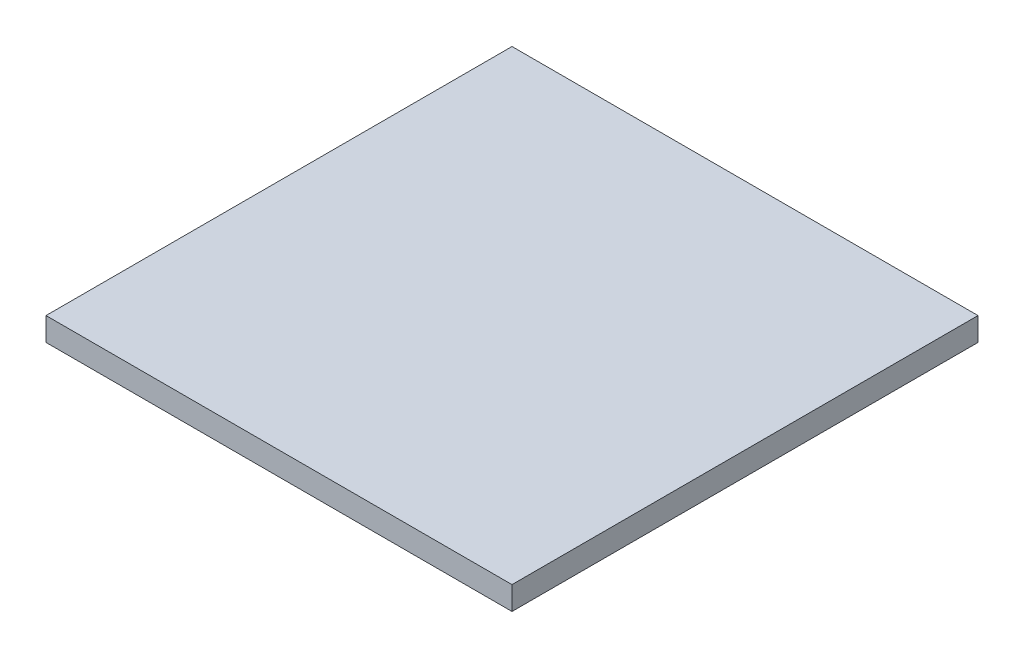
ISO-10303-21;
HEADER;
FILE_DESCRIPTION(('STEP AP214'),'2;1');
FILE_NAME('part.step','',(''),(''),'','','');
FILE_SCHEMA(('AUTOMOTIVE_DESIGN { 1 0 10303 214 1 1 1 1 }'));
ENDSEC;
DATA;
#1=APPLICATION_CONTEXT('core data for automotive mechanical design processes');
#2=APPLICATION_PROTOCOL_DEFINITION('international standard','automotive_design',2000,#1);
#3=PRODUCT_CONTEXT('',#1,'mechanical');
#4=PRODUCT('Part','Part','',(#3));
#5=PRODUCT_RELATED_PRODUCT_CATEGORY('part','',(#4));
#6=PRODUCT_DEFINITION_FORMATION('','',#4);
#7=PRODUCT_DEFINITION_CONTEXT('part definition',#1,'design');
#8=PRODUCT_DEFINITION('design','',#6,#7);
#9=PRODUCT_DEFINITION_SHAPE('','',#8);
#10=(LENGTH_UNIT() NAMED_UNIT(*) SI_UNIT(.MILLI.,.METRE.));
#11=(NAMED_UNIT(*) PLANE_ANGLE_UNIT() SI_UNIT($,.RADIAN.));
#12=(NAMED_UNIT(*) SI_UNIT($,.STERADIAN.) SOLID_ANGLE_UNIT());
#13=UNCERTAINTY_MEASURE_WITH_UNIT(LENGTH_MEASURE(1.E-05),#10,'distance_accuracy_value','');
#14=(GEOMETRIC_REPRESENTATION_CONTEXT(3) GLOBAL_UNCERTAINTY_ASSIGNED_CONTEXT((#13)) GLOBAL_UNIT_ASSIGNED_CONTEXT((#10,
#11,#12)) REPRESENTATION_CONTEXT('',''));
#15=CARTESIAN_POINT('',(0.,0.,0.));
#16=DIRECTION('',(0.,0.,1.));
#17=DIRECTION('',(1.,0.,0.));
#18=AXIS2_PLACEMENT_3D('',#15,#16,#17);
#19=CARTESIAN_POINT('',(10000.,-1000.,-10000.));
#20=DIRECTION('',(1.,0.,0.));
#21=DIRECTION('',(0.,0.,-1.));
#22=AXIS2_PLACEMENT_3D('',#19,#20,#21);
#23=PLANE('',#22);
#24=DIRECTION('',(0.,0.,-1.));
#25=VECTOR('',#24,1.);
#26=CARTESIAN_POINT('',(10000.,0.,-10000.));
#27=LINE('',#26,#25);
#28=CARTESIAN_POINT('',(10000.,0.,10000.));
#29=VERTEX_POINT('',#28);
#30=CARTESIAN_POINT('',(10000.,0.,-10000.));
#31=VERTEX_POINT('',#30);
#32=EDGE_CURVE('E97',#29,#31,#27,.T.);
#33=ORIENTED_EDGE('',*,*,#32,.F.);
#34=DIRECTION('',(0.,1.,0.));
#35=VECTOR('',#34,1.);
#36=CARTESIAN_POINT('',(10000.,-1000.,10000.));
#37=LINE('',#36,#35);
#38=CARTESIAN_POINT('',(10000.,-1000.,10000.));
#39=VERTEX_POINT('',#38);
#40=EDGE_CURVE('E11',#39,#29,#37,.T.);
#41=ORIENTED_EDGE('',*,*,#40,.F.);
#42=DIRECTION('',(0.,0.,-1.));
#43=VECTOR('',#42,1.);
#44=CARTESIAN_POINT('',(10000.,-1000.,-10000.));
#45=LINE('',#44,#43);
#46=CARTESIAN_POINT('',(10000.,-1000.,-10000.));
#47=VERTEX_POINT('',#46);
#48=EDGE_CURVE('E91',#39,#47,#45,.T.);
#49=ORIENTED_EDGE('',*,*,#48,.T.);
#50=DIRECTION('',(0.,1.,0.));
#51=VECTOR('',#50,1.);
#52=CARTESIAN_POINT('',(10000.,-1000.,-10000.));
#53=LINE('',#52,#51);
#54=EDGE_CURVE('E36',#47,#31,#53,.T.);
#55=ORIENTED_EDGE('',*,*,#54,.T.);
#56=EDGE_LOOP('',(#33,#41,#49,#55));
#57=FACE_BOUND('',#56,.T.);
#58=ADVANCED_FACE('F33',(#57),#23,.T.);
#59=CARTESIAN_POINT('',(-10000.,-1000.,10000.));
#60=DIRECTION('',(0.,0.,1.));
#61=DIRECTION('',(1.,0.,0.));
#62=AXIS2_PLACEMENT_3D('',#59,#60,#61);
#63=PLANE('',#62);
#64=DIRECTION('',(1.,0.,0.));
#65=VECTOR('',#64,1.);
#66=CARTESIAN_POINT('',(-10000.,0.,10000.));
#67=LINE('',#66,#65);
#68=CARTESIAN_POINT('',(-10000.,0.,10000.));
#69=VERTEX_POINT('',#68);
#70=EDGE_CURVE('E93',#69,#29,#67,.T.);
#71=ORIENTED_EDGE('',*,*,#70,.F.);
#72=DIRECTION('',(0.,1.,0.));
#73=VECTOR('',#72,1.);
#74=CARTESIAN_POINT('',(-10000.,-1000.,10000.));
#75=LINE('',#74,#73);
#76=CARTESIAN_POINT('',(-10000.,-1000.,10000.));
#77=VERTEX_POINT('',#76);
#78=EDGE_CURVE('E42',#77,#69,#75,.T.);
#79=ORIENTED_EDGE('',*,*,#78,.F.);
#80=DIRECTION('',(1.,0.,0.));
#81=VECTOR('',#80,1.);
#82=CARTESIAN_POINT('',(-10000.,-1000.,10000.));
#83=LINE('',#82,#81);
#84=EDGE_CURVE('E88',#77,#39,#83,.T.);
#85=ORIENTED_EDGE('',*,*,#84,.T.);
#86=ORIENTED_EDGE('',*,*,#40,.T.);
#87=EDGE_LOOP('',(#71,#79,#85,#86));
#88=FACE_BOUND('',#87,.T.);
#89=ADVANCED_FACE('F107',(#88),#63,.T.);
#90=CARTESIAN_POINT('',(-10000.,-1000.,-10000.));
#91=DIRECTION('',(-1.,0.,0.));
#92=DIRECTION('',(0.,0.,1.));
#93=AXIS2_PLACEMENT_3D('',#90,#91,#92);
#94=PLANE('',#93);
#95=DIRECTION('',(0.,0.,1.));
#96=VECTOR('',#95,1.);
#97=CARTESIAN_POINT('',(-10000.,0.,-10000.));
#98=LINE('',#97,#96);
#99=CARTESIAN_POINT('',(-10000.,0.,-10000.));
#100=VERTEX_POINT('',#99);
#101=EDGE_CURVE('E83',#100,#69,#98,.T.);
#102=ORIENTED_EDGE('',*,*,#101,.F.);
#103=DIRECTION('',(0.,1.,0.));
#104=VECTOR('',#103,1.);
#105=CARTESIAN_POINT('',(-10000.,-1000.,-10000.));
#106=LINE('',#105,#104);
#107=CARTESIAN_POINT('',(-10000.,-1000.,-10000.));
#108=VERTEX_POINT('',#107);
#109=EDGE_CURVE('E78',#108,#100,#106,.T.);
#110=ORIENTED_EDGE('',*,*,#109,.F.);
#111=DIRECTION('',(0.,0.,1.));
#112=VECTOR('',#111,1.);
#113=CARTESIAN_POINT('',(-10000.,-1000.,-10000.));
#114=LINE('',#113,#112);
#115=EDGE_CURVE('E81',#108,#77,#114,.T.);
#116=ORIENTED_EDGE('',*,*,#115,.T.);
#117=ORIENTED_EDGE('',*,*,#78,.T.);
#118=EDGE_LOOP('',(#102,#110,#116,#117));
#119=FACE_BOUND('',#118,.T.);
#120=ADVANCED_FACE('F80',(#119),#94,.T.);
#121=CARTESIAN_POINT('',(-10000.,-1000.,-10000.));
#122=DIRECTION('',(0.,0.,-1.));
#123=DIRECTION('',(-1.,0.,0.));
#124=AXIS2_PLACEMENT_3D('',#121,#122,#123);
#125=PLANE('',#124);
#126=DIRECTION('',(-1.,0.,0.));
#127=VECTOR('',#126,1.);
#128=CARTESIAN_POINT('',(-10000.,0.,-10000.));
#129=LINE('',#128,#127);
#130=EDGE_CURVE('E100',#31,#100,#129,.T.);
#131=ORIENTED_EDGE('',*,*,#130,.F.);
#132=ORIENTED_EDGE('',*,*,#54,.F.);
#133=DIRECTION('',(-1.,0.,0.));
#134=VECTOR('',#133,1.);
#135=CARTESIAN_POINT('',(-10000.,-1000.,-10000.));
#136=LINE('',#135,#134);
#137=EDGE_CURVE('E87',#47,#108,#136,.T.);
#138=ORIENTED_EDGE('',*,*,#137,.T.);
#139=ORIENTED_EDGE('',*,*,#109,.T.);
#140=EDGE_LOOP('',(#131,#132,#138,#139));
#141=FACE_BOUND('',#140,.T.);
#142=ADVANCED_FACE('F90',(#141),#125,.T.);
#143=CARTESIAN_POINT('',(0.,-1000.,0.));
#144=DIRECTION('',(0.,1.,0.));
#145=DIRECTION('',(0.,0.,1.));
#146=AXIS2_PLACEMENT_3D('',#143,#144,#145);
#147=PLANE('',#146);
#148=ORIENTED_EDGE('',*,*,#48,.F.);
#149=ORIENTED_EDGE('',*,*,#84,.F.);
#150=ORIENTED_EDGE('',*,*,#115,.F.);
#151=ORIENTED_EDGE('',*,*,#137,.F.);
#152=EDGE_LOOP('',(#148,#149,#150,#151));
#153=FACE_BOUND('',#152,.T.);
#154=ADVANCED_FACE('F86',(#153),#147,.F.);
#155=CARTESIAN_POINT('',(0.,0.,0.));
#156=DIRECTION('',(0.,1.,0.));
#157=DIRECTION('',(0.,0.,1.));
#158=AXIS2_PLACEMENT_3D('',#155,#156,#157);
#159=PLANE('',#158);
#160=ORIENTED_EDGE('',*,*,#32,.T.);
#161=ORIENTED_EDGE('',*,*,#130,.T.);
#162=ORIENTED_EDGE('',*,*,#101,.T.);
#163=ORIENTED_EDGE('',*,*,#70,.T.);
#164=EDGE_LOOP('',(#160,#161,#162,#163));
#165=FACE_BOUND('',#164,.T.);
#166=ADVANCED_FACE('F106',(#165),#159,.T.);
#167=CLOSED_SHELL('',(#58,#89,#120,#142,#154,#166));
#168=MANIFOLD_SOLID_BREP('B2',#167);
#169=ADVANCED_BREP_SHAPE_REPRESENTATION('',(#18,#168),#14);
#170=SHAPE_DEFINITION_REPRESENTATION(#9,#169);
ENDSEC;
END-ISO-10303-21;
